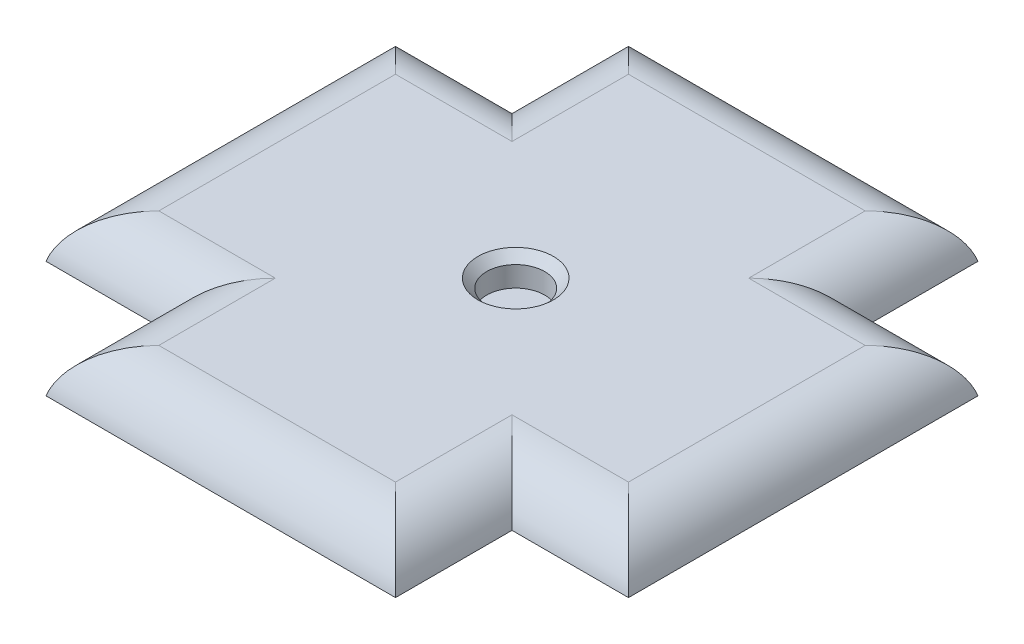
ISO-10303-21;
HEADER;
FILE_DESCRIPTION(('STEP AP214'),'2;1');
FILE_NAME('part.step','',(''),(''),'','','');
FILE_SCHEMA(('AUTOMOTIVE_DESIGN { 1 0 10303 214 1 1 1 1 }'));
ENDSEC;
DATA;
#1=APPLICATION_CONTEXT('core data for automotive mechanical design processes');
#2=APPLICATION_PROTOCOL_DEFINITION('international standard','automotive_design',2000,#1);
#3=PRODUCT_CONTEXT('',#1,'mechanical');
#4=PRODUCT('Part','Part','',(#3));
#5=PRODUCT_RELATED_PRODUCT_CATEGORY('part','',(#4));
#6=PRODUCT_DEFINITION_FORMATION('','',#4);
#7=PRODUCT_DEFINITION_CONTEXT('part definition',#1,'design');
#8=PRODUCT_DEFINITION('design','',#6,#7);
#9=PRODUCT_DEFINITION_SHAPE('','',#8);
#10=(LENGTH_UNIT() NAMED_UNIT(*) SI_UNIT(.MILLI.,.METRE.));
#11=(NAMED_UNIT(*) PLANE_ANGLE_UNIT() SI_UNIT($,.RADIAN.));
#12=(NAMED_UNIT(*) SI_UNIT($,.STERADIAN.) SOLID_ANGLE_UNIT());
#13=UNCERTAINTY_MEASURE_WITH_UNIT(LENGTH_MEASURE(1.E-05),#10,'distance_accuracy_value','');
#14=(GEOMETRIC_REPRESENTATION_CONTEXT(3) GLOBAL_UNCERTAINTY_ASSIGNED_CONTEXT((#13)) GLOBAL_UNIT_ASSIGNED_CONTEXT((#10,
#11,#12)) REPRESENTATION_CONTEXT('',''));
#15=CARTESIAN_POINT('',(0.,0.,0.));
#16=DIRECTION('',(0.,0.,1.));
#17=DIRECTION('',(1.,0.,0.));
#18=AXIS2_PLACEMENT_3D('',#15,#16,#17);
#19=CARTESIAN_POINT('',(0.,7.5,0.));
#20=DIRECTION('',(0.,1.,0.));
#21=DIRECTION('',(0.,0.,1.));
#22=AXIS2_PLACEMENT_3D('',#19,#20,#21);
#23=PLANE('',#22);
#24=CARTESIAN_POINT('',(50.3175416344815,7.5,49.6824583655185));
#25=DIRECTION('',(0.,1.,0.));
#26=DIRECTION('',(0.,0.,1.));
#27=AXIS2_PLACEMENT_3D('',#24,#25,#26);
#28=CIRCLE('',#27,6.47500000000002);
#29=CARTESIAN_POINT('',(50.3175416344815,7.5,56.1574583655186));
#30=VERTEX_POINT('',#29);
#31=EDGE_CURVE('E11',#30,#30,#28,.F.);
#32=ORIENTED_EDGE('',*,*,#31,.T.);
#33=EDGE_LOOP('',(#32));
#34=FACE_BOUND('',#33,.T.);
#35=DIRECTION('',(0.,0.,1.));
#36=VECTOR('',#35,1.);
#37=CARTESIAN_POINT('',(29.6824583655185,7.5,100.));
#38=LINE('',#37,#36);
#39=CARTESIAN_POINT('',(29.6824583655185,7.5,70.3175416344815));
#40=VERTEX_POINT('',#39);
#41=CARTESIAN_POINT('',(29.6824583655185,7.5,90.3175416344815));
#42=VERTEX_POINT('',#41);
#43=EDGE_CURVE('E60',#40,#42,#38,.T.);
#44=ORIENTED_EDGE('',*,*,#43,.T.);
#45=DIRECTION('',(-1.,0.,0.));
#46=VECTOR('',#45,1.);
#47=CARTESIAN_POINT('',(80.,7.5,90.3175416344815));
#48=LINE('',#47,#46);
#49=CARTESIAN_POINT('',(70.3175416344815,7.5,90.3175416344815));
#50=VERTEX_POINT('',#49);
#51=EDGE_CURVE('E64',#42,#50,#48,.F.);
#52=ORIENTED_EDGE('',*,*,#51,.T.);
#53=DIRECTION('',(0.,0.,1.));
#54=VECTOR('',#53,1.);
#55=CARTESIAN_POINT('',(70.3175416344815,7.5,80.));
#56=LINE('',#55,#54);
#57=CARTESIAN_POINT('',(70.3175416344815,7.5,70.3175416344815));
#58=VERTEX_POINT('',#57);
#59=EDGE_CURVE('E148',#50,#58,#56,.F.);
#60=ORIENTED_EDGE('',*,*,#59,.T.);
#61=DIRECTION('',(1.,0.,0.));
#62=VECTOR('',#61,1.);
#63=CARTESIAN_POINT('',(100.,7.5,70.3175416344815));
#64=LINE('',#63,#62);
#65=CARTESIAN_POINT('',(90.3175416344815,7.5,70.3175416344815));
#66=VERTEX_POINT('',#65);
#67=EDGE_CURVE('E224',#58,#66,#64,.T.);
#68=ORIENTED_EDGE('',*,*,#67,.T.);
#69=DIRECTION('',(0.,0.,-1.));
#70=VECTOR('',#69,1.);
#71=CARTESIAN_POINT('',(90.3175416344815,7.5,20.));
#72=LINE('',#71,#70);
#73=CARTESIAN_POINT('',(90.3175416344815,7.5,29.6824583655185));
#74=VERTEX_POINT('',#73);
#75=EDGE_CURVE('E221',#66,#74,#72,.T.);
#76=ORIENTED_EDGE('',*,*,#75,.T.);
#77=DIRECTION('',(-1.,0.,0.));
#78=VECTOR('',#77,1.);
#79=CARTESIAN_POINT('',(80.,7.5,29.6824583655185));
#80=LINE('',#79,#78);
#81=CARTESIAN_POINT('',(70.3175416344815,7.5,29.6824583655185));
#82=VERTEX_POINT('',#81);
#83=EDGE_CURVE('E215',#74,#82,#80,.T.);
#84=ORIENTED_EDGE('',*,*,#83,.T.);
#85=DIRECTION('',(0.,0.,-1.));
#86=VECTOR('',#85,1.);
#87=CARTESIAN_POINT('',(70.3175416344815,7.5,0.));
#88=LINE('',#87,#86);
#89=CARTESIAN_POINT('',(70.3175416344815,7.5,9.68245836551854));
#90=VERTEX_POINT('',#89);
#91=EDGE_CURVE('E212',#82,#90,#88,.T.);
#92=ORIENTED_EDGE('',*,*,#91,.T.);
#93=DIRECTION('',(-1.,0.,0.));
#94=VECTOR('',#93,1.);
#95=CARTESIAN_POINT('',(20.,7.5,9.68245836551854));
#96=LINE('',#95,#94);
#97=CARTESIAN_POINT('',(29.6824583655185,7.5,9.68245836551854));
#98=VERTEX_POINT('',#97);
#99=EDGE_CURVE('E209',#90,#98,#96,.T.);
#100=ORIENTED_EDGE('',*,*,#99,.T.);
#101=DIRECTION('',(0.,0.,-1.));
#102=VECTOR('',#101,1.);
#103=CARTESIAN_POINT('',(29.6824583655185,7.5,20.));
#104=LINE('',#103,#102);
#105=CARTESIAN_POINT('',(29.6824583655186,7.5,29.6824583655185));
#106=VERTEX_POINT('',#105);
#107=EDGE_CURVE('E203',#98,#106,#104,.F.);
#108=ORIENTED_EDGE('',*,*,#107,.T.);
#109=DIRECTION('',(-1.,0.,0.));
#110=VECTOR('',#109,1.);
#111=CARTESIAN_POINT('',(0.,7.5,29.6824583655185));
#112=LINE('',#111,#110);
#113=CARTESIAN_POINT('',(9.68245836551855,7.5,29.6824583655185));
#114=VERTEX_POINT('',#113);
#115=EDGE_CURVE('E200',#106,#114,#112,.T.);
#116=ORIENTED_EDGE('',*,*,#115,.T.);
#117=DIRECTION('',(0.,0.,-1.));
#118=VECTOR('',#117,1.);
#119=CARTESIAN_POINT('',(9.68245836551855,7.5,80.));
#120=LINE('',#119,#118);
#121=CARTESIAN_POINT('',(9.68245836551855,7.5,70.3175416344815));
#122=VERTEX_POINT('',#121);
#123=EDGE_CURVE('E206',#114,#122,#120,.F.);
#124=ORIENTED_EDGE('',*,*,#123,.T.);
#125=DIRECTION('',(-1.,0.,0.));
#126=VECTOR('',#125,1.);
#127=CARTESIAN_POINT('',(20.,7.5,70.3175416344815));
#128=LINE('',#127,#126);
#129=EDGE_CURVE('E218',#122,#40,#128,.F.);
#130=ORIENTED_EDGE('',*,*,#129,.T.);
#131=EDGE_LOOP('',(#44,#52,#60,#68,#76,#84,#92,#100,#108,#116,#124,#130));
#132=FACE_BOUND('',#131,.T.);
#133=ADVANCED_FACE('F43',(#34,#132),#23,.T.);
#134=CARTESIAN_POINT('',(0.,0.,0.));
#135=DIRECTION('',(0.,1.,0.));
#136=DIRECTION('',(0.,0.,1.));
#137=AXIS2_PLACEMENT_3D('',#134,#135,#136);
#138=PLANE('',#137);
#139=DIRECTION('',(1.,0.,0.));
#140=VECTOR('',#139,1.);
#141=CARTESIAN_POINT('',(0.,0.,100.));
#142=LINE('',#141,#140);
#143=CARTESIAN_POINT('',(20.,0.,100.));
#144=VERTEX_POINT('',#143);
#145=CARTESIAN_POINT('',(80.,0.,100.));
#146=VERTEX_POINT('',#145);
#147=EDGE_CURVE('E136',#144,#146,#142,.T.);
#148=ORIENTED_EDGE('',*,*,#147,.F.);
#149=DIRECTION('',(0.,0.,-1.));
#150=VECTOR('',#149,1.);
#151=CARTESIAN_POINT('',(20.,0.,0.));
#152=LINE('',#151,#150);
#153=CARTESIAN_POINT('',(20.,0.,80.));
#154=VERTEX_POINT('',#153);
#155=EDGE_CURVE('E197',#144,#154,#152,.T.);
#156=ORIENTED_EDGE('',*,*,#155,.T.);
#157=DIRECTION('',(1.,0.,0.));
#158=VECTOR('',#157,1.);
#159=CARTESIAN_POINT('',(0.,0.,80.));
#160=LINE('',#159,#158);
#161=CARTESIAN_POINT('',(0.,0.,80.));
#162=VERTEX_POINT('',#161);
#163=EDGE_CURVE('E193',#162,#154,#160,.T.);
#164=ORIENTED_EDGE('',*,*,#163,.F.);
#165=DIRECTION('',(0.,0.,1.));
#166=VECTOR('',#165,1.);
#167=CARTESIAN_POINT('',(0.,0.,0.));
#168=LINE('',#167,#166);
#169=CARTESIAN_POINT('',(0.,0.,20.));
#170=VERTEX_POINT('',#169);
#171=EDGE_CURVE('E189',#170,#162,#168,.T.);
#172=ORIENTED_EDGE('',*,*,#171,.F.);
#173=DIRECTION('',(1.,0.,0.));
#174=VECTOR('',#173,1.);
#175=CARTESIAN_POINT('',(0.,0.,20.));
#176=LINE('',#175,#174);
#177=CARTESIAN_POINT('',(20.,0.,20.));
#178=VERTEX_POINT('',#177);
#179=EDGE_CURVE('E186',#170,#178,#176,.T.);
#180=ORIENTED_EDGE('',*,*,#179,.T.);
#181=DIRECTION('',(0.,0.,1.));
#182=VECTOR('',#181,1.);
#183=CARTESIAN_POINT('',(20.,0.,0.));
#184=LINE('',#183,#182);
#185=CARTESIAN_POINT('',(20.,0.,0.));
#186=VERTEX_POINT('',#185);
#187=EDGE_CURVE('E182',#186,#178,#184,.T.);
#188=ORIENTED_EDGE('',*,*,#187,.F.);
#189=DIRECTION('',(1.,0.,0.));
#190=VECTOR('',#189,1.);
#191=CARTESIAN_POINT('',(0.,0.,0.));
#192=LINE('',#191,#190);
#193=CARTESIAN_POINT('',(80.,0.,0.));
#194=VERTEX_POINT('',#193);
#195=EDGE_CURVE('E179',#186,#194,#192,.T.);
#196=ORIENTED_EDGE('',*,*,#195,.T.);
#197=DIRECTION('',(0.,0.,1.));
#198=VECTOR('',#197,1.);
#199=CARTESIAN_POINT('',(80.,0.,0.));
#200=LINE('',#199,#198);
#201=CARTESIAN_POINT('',(80.,0.,20.));
#202=VERTEX_POINT('',#201);
#203=EDGE_CURVE('E176',#194,#202,#200,.T.);
#204=ORIENTED_EDGE('',*,*,#203,.T.);
#205=DIRECTION('',(1.,0.,0.));
#206=VECTOR('',#205,1.);
#207=CARTESIAN_POINT('',(0.,0.,20.));
#208=LINE('',#207,#206);
#209=CARTESIAN_POINT('',(100.,0.,20.));
#210=VERTEX_POINT('',#209);
#211=EDGE_CURVE('E173',#202,#210,#208,.T.);
#212=ORIENTED_EDGE('',*,*,#211,.T.);
#213=DIRECTION('',(0.,0.,1.));
#214=VECTOR('',#213,1.);
#215=CARTESIAN_POINT('',(100.,0.,0.));
#216=LINE('',#215,#214);
#217=CARTESIAN_POINT('',(100.,0.,80.));
#218=VERTEX_POINT('',#217);
#219=EDGE_CURVE('E170',#210,#218,#216,.T.);
#220=ORIENTED_EDGE('',*,*,#219,.T.);
#221=DIRECTION('',(-1.,0.,0.));
#222=VECTOR('',#221,1.);
#223=CARTESIAN_POINT('',(0.,0.,80.));
#224=LINE('',#223,#222);
#225=CARTESIAN_POINT('',(80.,0.,80.));
#226=VERTEX_POINT('',#225);
#227=EDGE_CURVE('E139',#218,#226,#224,.T.);
#228=ORIENTED_EDGE('',*,*,#227,.T.);
#229=DIRECTION('',(0.,0.,-1.));
#230=VECTOR('',#229,1.);
#231=CARTESIAN_POINT('',(80.,0.,0.));
#232=LINE('',#231,#230);
#233=EDGE_CURVE('E132',#146,#226,#232,.T.);
#234=ORIENTED_EDGE('',*,*,#233,.F.);
#235=EDGE_LOOP('',(#148,#156,#164,#172,#180,#188,#196,#204,#212,#220,#228,#234));
#236=FACE_BOUND('',#235,.T.);
#237=ADVANCED_FACE('F134',(#236),#138,.F.);
#238=CARTESIAN_POINT('',(0.,-2.5,29.6824583655185));
#239=DIRECTION('',(1.,0.,0.));
#240=DIRECTION('',(0.,0.,-1.));
#241=AXIS2_PLACEMENT_3D('',#238,#239,#240);
#242=CYLINDRICAL_SURFACE('',#241,10.);
#243=CARTESIAN_POINT('',(90.3175416344815,-2.5,29.6824583655185));
#244=DIRECTION('',(0.707106781186547,0.,0.707106781186548));
#245=DIRECTION('',(-0.707106781186548,0.,0.707106781186547));
#246=AXIS2_PLACEMENT_3D('',#243,#244,#245);
#247=ELLIPSE('',#246,14.1421356237309,10.);
#248=EDGE_CURVE('E163',#210,#74,#247,.T.);
#249=ORIENTED_EDGE('',*,*,#248,.F.);
#250=ORIENTED_EDGE('',*,*,#211,.F.);
#251=CARTESIAN_POINT('',(70.3175416344815,-2.5,29.6824583655185));
#252=DIRECTION('',(0.707106781186547,0.,0.707106781186548));
#253=DIRECTION('',(0.707106781186548,0.,-0.707106781186547));
#254=AXIS2_PLACEMENT_3D('',#251,#252,#253);
#255=ELLIPSE('',#254,14.1421356237309,10.);
#256=EDGE_CURVE('E159',#82,#202,#255,.F.);
#257=ORIENTED_EDGE('',*,*,#256,.F.);
#258=ORIENTED_EDGE('',*,*,#83,.F.);
#259=EDGE_LOOP('',(#249,#250,#257,#258));
#260=FACE_BOUND('',#259,.T.);
#261=ADVANCED_FACE('F286',(#260),#242,.T.);
#262=CARTESIAN_POINT('',(70.3175416344815,-2.5,0.));
#263=DIRECTION('',(0.,0.,1.));
#264=DIRECTION('',(1.,0.,0.));
#265=AXIS2_PLACEMENT_3D('',#262,#263,#264);
#266=CYLINDRICAL_SURFACE('',#265,10.);
#267=ORIENTED_EDGE('',*,*,#256,.T.);
#268=ORIENTED_EDGE('',*,*,#203,.F.);
#269=CARTESIAN_POINT('',(70.3175416344815,-2.5,9.68245836551854));
#270=DIRECTION('',(0.707106781186547,0.,0.707106781186547));
#271=DIRECTION('',(0.707106781186547,0.,-0.707106781186547));
#272=AXIS2_PLACEMENT_3D('',#269,#270,#271);
#273=ELLIPSE('',#272,14.1421356237309,10.);
#274=EDGE_CURVE('E258',#90,#194,#273,.F.);
#275=ORIENTED_EDGE('',*,*,#274,.F.);
#276=ORIENTED_EDGE('',*,*,#91,.F.);
#277=EDGE_LOOP('',(#267,#268,#275,#276));
#278=FACE_BOUND('',#277,.T.);
#279=ADVANCED_FACE('F325',(#278),#266,.T.);
#280=CARTESIAN_POINT('',(90.3175416344815,-2.5,0.));
#281=DIRECTION('',(0.,0.,1.));
#282=DIRECTION('',(1.,0.,0.));
#283=AXIS2_PLACEMENT_3D('',#280,#281,#282);
#284=CYLINDRICAL_SURFACE('',#283,10.);
#285=ORIENTED_EDGE('',*,*,#248,.T.);
#286=ORIENTED_EDGE('',*,*,#75,.F.);
#287=CARTESIAN_POINT('',(90.3175416344815,-2.5,70.3175416344815));
#288=DIRECTION('',(-0.707106781186547,0.,0.707106781186547));
#289=DIRECTION('',(0.707106781186547,0.,0.707106781186547));
#290=AXIS2_PLACEMENT_3D('',#287,#288,#289);
#291=ELLIPSE('',#290,14.1421356237309,10.);
#292=EDGE_CURVE('E254',#218,#66,#291,.T.);
#293=ORIENTED_EDGE('',*,*,#292,.F.);
#294=ORIENTED_EDGE('',*,*,#219,.F.);
#295=EDGE_LOOP('',(#285,#286,#293,#294));
#296=FACE_BOUND('',#295,.T.);
#297=ADVANCED_FACE('F321',(#296),#284,.T.);
#298=CARTESIAN_POINT('',(0.,-2.5,9.68245836551854));
#299=DIRECTION('',(1.,0.,0.));
#300=DIRECTION('',(0.,0.,-1.));
#301=AXIS2_PLACEMENT_3D('',#298,#299,#300);
#302=CYLINDRICAL_SURFACE('',#301,10.);
#303=ORIENTED_EDGE('',*,*,#274,.T.);
#304=ORIENTED_EDGE('',*,*,#195,.F.);
#305=CARTESIAN_POINT('',(29.6824583655185,-2.5,9.68245836551854));
#306=DIRECTION('',(-0.707106781186547,0.,0.707106781186548));
#307=DIRECTION('',(0.707106781186548,0.,0.707106781186547));
#308=AXIS2_PLACEMENT_3D('',#305,#306,#307);
#309=ELLIPSE('',#308,14.142135623731,10.);
#310=EDGE_CURVE('E250',#98,#186,#309,.T.);
#311=ORIENTED_EDGE('',*,*,#310,.F.);
#312=ORIENTED_EDGE('',*,*,#99,.F.);
#313=EDGE_LOOP('',(#303,#304,#311,#312));
#314=FACE_BOUND('',#313,.T.);
#315=ADVANCED_FACE('F317',(#314),#302,.T.);
#316=CARTESIAN_POINT('',(0.,-2.5,70.3175416344815));
#317=DIRECTION('',(-1.,0.,0.));
#318=DIRECTION('',(0.,0.,1.));
#319=AXIS2_PLACEMENT_3D('',#316,#317,#318);
#320=CYLINDRICAL_SURFACE('',#319,10.);
#321=ORIENTED_EDGE('',*,*,#292,.T.);
#322=ORIENTED_EDGE('',*,*,#67,.F.);
#323=CARTESIAN_POINT('',(70.3175416344815,-2.5,70.3175416344815));
#324=DIRECTION('',(0.707106781186547,0.,-0.707106781186547));
#325=DIRECTION('',(-0.707106781186547,0.,-0.707106781186547));
#326=AXIS2_PLACEMENT_3D('',#323,#324,#325);
#327=ELLIPSE('',#326,14.1421356237309,10.);
#328=EDGE_CURVE('E247',#226,#58,#327,.F.);
#329=ORIENTED_EDGE('',*,*,#328,.F.);
#330=ORIENTED_EDGE('',*,*,#227,.F.);
#331=EDGE_LOOP('',(#321,#322,#329,#330));
#332=FACE_BOUND('',#331,.T.);
#333=ADVANCED_FACE('F313',(#332),#320,.T.);
#334=CARTESIAN_POINT('',(29.6824583655185,-2.5,0.));
#335=DIRECTION('',(0.,0.,1.));
#336=DIRECTION('',(1.,0.,0.));
#337=AXIS2_PLACEMENT_3D('',#334,#335,#336);
#338=CYLINDRICAL_SURFACE('',#337,10.);
#339=ORIENTED_EDGE('',*,*,#310,.T.);
#340=ORIENTED_EDGE('',*,*,#187,.T.);
#341=CARTESIAN_POINT('',(29.6824583655186,-2.5,29.6824583655185));
#342=DIRECTION('',(-0.707106781186547,0.,0.707106781186548));
#343=DIRECTION('',(0.707106781186548,0.,0.707106781186547));
#344=AXIS2_PLACEMENT_3D('',#341,#342,#343);
#345=ELLIPSE('',#344,14.142135623731,10.);
#346=EDGE_CURVE('E151',#106,#178,#345,.T.);
#347=ORIENTED_EDGE('',*,*,#346,.F.);
#348=ORIENTED_EDGE('',*,*,#107,.F.);
#349=EDGE_LOOP('',(#339,#340,#347,#348));
#350=FACE_BOUND('',#349,.T.);
#351=ADVANCED_FACE('F310',(#350),#338,.T.);
#352=CARTESIAN_POINT('',(70.3175416344815,-2.5,0.));
#353=DIRECTION('',(0.,0.,-1.));
#354=DIRECTION('',(-1.,0.,0.));
#355=AXIS2_PLACEMENT_3D('',#352,#353,#354);
#356=CYLINDRICAL_SURFACE('',#355,10.);
#357=ORIENTED_EDGE('',*,*,#328,.T.);
#358=ORIENTED_EDGE('',*,*,#59,.F.);
#359=CARTESIAN_POINT('',(70.3175416344815,-2.5,90.3175416344815));
#360=DIRECTION('',(0.707106781186547,0.,-0.707106781186547));
#361=DIRECTION('',(0.707106781186547,0.,0.707106781186547));
#362=AXIS2_PLACEMENT_3D('',#359,#360,#361);
#363=ELLIPSE('',#362,14.1421356237309,10.);
#364=EDGE_CURVE('E146',#146,#50,#363,.F.);
#365=ORIENTED_EDGE('',*,*,#364,.F.);
#366=ORIENTED_EDGE('',*,*,#233,.T.);
#367=EDGE_LOOP('',(#357,#358,#365,#366));
#368=FACE_BOUND('',#367,.T.);
#369=ADVANCED_FACE('F147',(#368),#356,.T.);
#370=CARTESIAN_POINT('',(0.,-2.5,29.6824583655185));
#371=DIRECTION('',(1.,0.,0.));
#372=DIRECTION('',(0.,0.,-1.));
#373=AXIS2_PLACEMENT_3D('',#370,#371,#372);
#374=CYLINDRICAL_SURFACE('',#373,10.);
#375=ORIENTED_EDGE('',*,*,#346,.T.);
#376=ORIENTED_EDGE('',*,*,#179,.F.);
#377=CARTESIAN_POINT('',(9.68245836551855,-2.5,29.6824583655185));
#378=DIRECTION('',(0.707106781186547,0.,-0.707106781186548));
#379=DIRECTION('',(0.707106781186548,0.,0.707106781186547));
#380=AXIS2_PLACEMENT_3D('',#377,#378,#379);
#381=ELLIPSE('',#380,14.142135623731,10.);
#382=EDGE_CURVE('E152',#114,#170,#381,.F.);
#383=ORIENTED_EDGE('',*,*,#382,.F.);
#384=ORIENTED_EDGE('',*,*,#115,.F.);
#385=EDGE_LOOP('',(#375,#376,#383,#384));
#386=FACE_BOUND('',#385,.T.);
#387=ADVANCED_FACE('F304',(#386),#374,.T.);
#388=CARTESIAN_POINT('',(0.,-2.5,90.3175416344815));
#389=DIRECTION('',(1.,0.,0.));
#390=DIRECTION('',(0.,0.,-1.));
#391=AXIS2_PLACEMENT_3D('',#388,#389,#390);
#392=CYLINDRICAL_SURFACE('',#391,10.);
#393=ORIENTED_EDGE('',*,*,#364,.T.);
#394=ORIENTED_EDGE('',*,*,#51,.F.);
#395=CARTESIAN_POINT('',(29.6824583655185,-2.5,90.3175416344815));
#396=DIRECTION('',(0.707106781186548,0.,0.707106781186547));
#397=DIRECTION('',(0.707106781186547,0.,-0.707106781186548));
#398=AXIS2_PLACEMENT_3D('',#395,#396,#397);
#399=ELLIPSE('',#398,14.1421356237309,10.);
#400=EDGE_CURVE('E156',#144,#42,#399,.F.);
#401=ORIENTED_EDGE('',*,*,#400,.F.);
#402=ORIENTED_EDGE('',*,*,#147,.T.);
#403=EDGE_LOOP('',(#393,#394,#401,#402));
#404=FACE_BOUND('',#403,.T.);
#405=ADVANCED_FACE('F154',(#404),#392,.T.);
#406=CARTESIAN_POINT('',(9.68245836551854,-2.5,0.));
#407=DIRECTION('',(0.,0.,1.));
#408=DIRECTION('',(1.,0.,0.));
#409=AXIS2_PLACEMENT_3D('',#406,#407,#408);
#410=CYLINDRICAL_SURFACE('',#409,10.);
#411=ORIENTED_EDGE('',*,*,#382,.T.);
#412=ORIENTED_EDGE('',*,*,#171,.T.);
#413=CARTESIAN_POINT('',(9.68245836551855,-2.5,70.3175416344815));
#414=DIRECTION('',(0.707106781186548,0.,0.707106781186547));
#415=DIRECTION('',(-0.707106781186547,0.,0.707106781186548));
#416=AXIS2_PLACEMENT_3D('',#413,#414,#415);
#417=ELLIPSE('',#416,14.1421356237309,10.);
#418=EDGE_CURVE('E236',#122,#162,#417,.T.);
#419=ORIENTED_EDGE('',*,*,#418,.F.);
#420=ORIENTED_EDGE('',*,*,#123,.F.);
#421=EDGE_LOOP('',(#411,#412,#419,#420));
#422=FACE_BOUND('',#421,.T.);
#423=ADVANCED_FACE('F297',(#422),#410,.T.);
#424=CARTESIAN_POINT('',(29.6824583655185,-2.5,0.));
#425=DIRECTION('',(0.,0.,-1.));
#426=DIRECTION('',(-1.,0.,0.));
#427=AXIS2_PLACEMENT_3D('',#424,#425,#426);
#428=CYLINDRICAL_SURFACE('',#427,10.);
#429=ORIENTED_EDGE('',*,*,#400,.T.);
#430=ORIENTED_EDGE('',*,*,#43,.F.);
#431=CARTESIAN_POINT('',(29.6824583655185,-2.5,70.3175416344815));
#432=DIRECTION('',(0.707106781186548,0.,0.707106781186547));
#433=DIRECTION('',(0.707106781186547,0.,-0.707106781186548));
#434=AXIS2_PLACEMENT_3D('',#431,#432,#433);
#435=ELLIPSE('',#434,14.1421356237309,10.);
#436=EDGE_CURVE('E233',#154,#40,#435,.F.);
#437=ORIENTED_EDGE('',*,*,#436,.F.);
#438=ORIENTED_EDGE('',*,*,#155,.F.);
#439=EDGE_LOOP('',(#429,#430,#437,#438));
#440=FACE_BOUND('',#439,.T.);
#441=ADVANCED_FACE('F293',(#440),#428,.T.);
#442=CARTESIAN_POINT('',(0.,-2.5,70.3175416344815));
#443=DIRECTION('',(1.,0.,0.));
#444=DIRECTION('',(0.,0.,-1.));
#445=AXIS2_PLACEMENT_3D('',#442,#443,#444);
#446=CYLINDRICAL_SURFACE('',#445,10.);
#447=ORIENTED_EDGE('',*,*,#418,.T.);
#448=ORIENTED_EDGE('',*,*,#163,.T.);
#449=ORIENTED_EDGE('',*,*,#436,.T.);
#450=ORIENTED_EDGE('',*,*,#129,.F.);
#451=EDGE_LOOP('',(#447,#448,#449,#450));
#452=FACE_BOUND('',#451,.T.);
#453=ADVANCED_FACE('F290',(#452),#446,.T.);
#454=CARTESIAN_POINT('',(50.3175416344815,2.5,49.6824583655185));
#455=DIRECTION('',(0.,1.,0.));
#456=DIRECTION('',(0.,0.,1.));
#457=AXIS2_PLACEMENT_3D('',#454,#455,#456);
#458=CYLINDRICAL_SURFACE('',#457,4.975);
#459=CARTESIAN_POINT('',(50.3175416344815,5.99999999999997,49.6824583655185));
#460=DIRECTION('',(0.,1.,0.));
#461=DIRECTION('',(0.,0.,1.));
#462=AXIS2_PLACEMENT_3D('',#459,#460,#461);
#463=CIRCLE('',#462,4.975);
#464=CARTESIAN_POINT('',(50.3175416344815,5.99999999999997,54.6574583655185));
#465=VERTEX_POINT('',#464);
#466=EDGE_CURVE('E53',#465,#465,#463,.T.);
#467=ORIENTED_EDGE('',*,*,#466,.T.);
#468=EDGE_LOOP('',(#467));
#469=FACE_BOUND('',#468,.T.);
#470=CARTESIAN_POINT('',(50.3175416344815,2.5,49.6824583655185));
#471=DIRECTION('',(0.,1.,0.));
#472=DIRECTION('',(0.,0.,1.));
#473=AXIS2_PLACEMENT_3D('',#470,#471,#472);
#474=CIRCLE('',#473,4.975);
#475=CARTESIAN_POINT('',(50.3175416344815,2.5,54.6574583655185));
#476=VERTEX_POINT('',#475);
#477=EDGE_CURVE('E166',#476,#476,#474,.T.);
#478=ORIENTED_EDGE('',*,*,#477,.F.);
#479=EDGE_LOOP('',(#478));
#480=FACE_BOUND('',#479,.T.);
#481=ADVANCED_FACE('F268',(#469,#480),#458,.F.);
#482=CARTESIAN_POINT('',(50.3175416344815,2.5,49.6824583655185));
#483=DIRECTION('',(0.,1.,0.));
#484=DIRECTION('',(0.,0.,1.));
#485=AXIS2_PLACEMENT_3D('',#482,#483,#484);
#486=PLANE('',#485);
#487=ORIENTED_EDGE('',*,*,#477,.T.);
#488=EDGE_LOOP('',(#487));
#489=FACE_BOUND('',#488,.T.);
#490=ADVANCED_FACE('F272',(#489),#486,.T.);
#491=CARTESIAN_POINT('',(50.3175416344815,5.99999999999997,49.6824583655185));
#492=DIRECTION('',(0.,1.,0.));
#493=DIRECTION('',(0.,0.,1.));
#494=AXIS2_PLACEMENT_3D('',#491,#492,#493);
#495=CONICAL_SURFACE('',#494,4.975,0.785398163397447);
#496=CARTESIAN_POINT('',(50.3175416344815,7.5,56.1574583655186));
#497=CARTESIAN_POINT('',(50.3175416344815,7.484375,56.1418333655186));
#498=CARTESIAN_POINT('',(50.3175416344815,7.46875,56.1262083655186));
#499=CARTESIAN_POINT('',(50.3175416344815,7.4375,56.0949583655186));
#500=CARTESIAN_POINT('',(50.3175416344815,7.421875,56.0793333655186));
#501=CARTESIAN_POINT('',(50.3175416344815,7.390625,56.0480833655186));
#502=CARTESIAN_POINT('',(50.3175416344815,7.375,56.0324583655186));
#503=CARTESIAN_POINT('',(50.3175416344815,7.34375,56.0012083655186));
#504=CARTESIAN_POINT('',(50.3175416344815,7.328125,55.9855833655186));
#505=CARTESIAN_POINT('',(50.3175416344815,7.296875,55.9543333655186));
#506=CARTESIAN_POINT('',(50.3175416344815,7.28124999999999,55.9387083655186));
#507=CARTESIAN_POINT('',(50.3175416344815,7.24999999999999,55.9074583655186));
#508=CARTESIAN_POINT('',(50.3175416344815,7.23437499999999,55.8918333655186));
#509=CARTESIAN_POINT('',(50.3175416344815,7.20312499999999,55.8605833655186));
#510=CARTESIAN_POINT('',(50.3175416344815,7.18749999999999,55.8449583655186));
#511=CARTESIAN_POINT('',(50.3175416344815,7.15624999999999,55.8137083655186));
#512=CARTESIAN_POINT('',(50.3175416344815,7.14062499999999,55.7980833655186));
#513=CARTESIAN_POINT('',(50.3175416344815,7.10937499999999,55.7668333655186));
#514=CARTESIAN_POINT('',(50.3175416344815,7.09374999999999,55.7512083655186));
#515=CARTESIAN_POINT('',(50.3175416344815,7.06249999999999,55.7199583655186));
#516=CARTESIAN_POINT('',(50.3175416344815,7.04687499999999,55.7043333655186));
#517=CARTESIAN_POINT('',(50.3175416344815,7.01562499999999,55.6730833655186));
#518=CARTESIAN_POINT('',(50.3175416344815,6.99999999999999,55.6574583655186));
#519=CARTESIAN_POINT('',(50.3175416344815,6.96874999999999,55.6262083655186));
#520=CARTESIAN_POINT('',(50.3175416344815,6.95312499999999,55.6105833655186));
#521=CARTESIAN_POINT('',(50.3175416344815,6.92187499999999,55.5793333655186));
#522=CARTESIAN_POINT('',(50.3175416344815,6.90624999999999,55.5637083655186));
#523=CARTESIAN_POINT('',(50.3175416344815,6.87499999999999,55.5324583655186));
#524=CARTESIAN_POINT('',(50.3175416344815,6.85937499999999,55.5168333655186));
#525=CARTESIAN_POINT('',(50.3175416344815,6.82812499999999,55.4855833655186));
#526=CARTESIAN_POINT('',(50.3175416344815,6.81249999999999,55.4699583655186));
#527=CARTESIAN_POINT('',(50.3175416344815,6.78124999999999,55.4387083655186));
#528=CARTESIAN_POINT('',(50.3175416344815,6.76562499999998,55.4230833655186));
#529=CARTESIAN_POINT('',(50.3175416344815,6.73437499999998,55.3918333655186));
#530=CARTESIAN_POINT('',(50.3175416344815,6.71874999999998,55.3762083655186));
#531=CARTESIAN_POINT('',(50.3175416344815,6.68749999999998,55.3449583655186));
#532=CARTESIAN_POINT('',(50.3175416344815,6.67187499999998,55.3293333655186));
#533=CARTESIAN_POINT('',(50.3175416344815,6.64062499999998,55.2980833655186));
#534=CARTESIAN_POINT('',(50.3175416344815,6.62499999999998,55.2824583655186));
#535=CARTESIAN_POINT('',(50.3175416344815,6.59374999999998,55.2512083655186));
#536=CARTESIAN_POINT('',(50.3175416344815,6.57812499999998,55.2355833655186));
#537=CARTESIAN_POINT('',(50.3175416344815,6.54687499999998,55.2043333655186));
#538=CARTESIAN_POINT('',(50.3175416344815,6.53124999999998,55.1887083655186));
#539=CARTESIAN_POINT('',(50.3175416344815,6.49999999999998,55.1574583655186));
#540=CARTESIAN_POINT('',(50.3175416344815,6.48437499999998,55.1418333655186));
#541=CARTESIAN_POINT('',(50.3175416344815,6.45312499999998,55.1105833655186));
#542=CARTESIAN_POINT('',(50.3175416344815,6.43749999999998,55.0949583655185));
#543=CARTESIAN_POINT('',(50.3175416344815,6.40624999999998,55.0637083655186));
#544=CARTESIAN_POINT('',(50.3175416344815,6.39062499999998,55.0480833655186));
#545=CARTESIAN_POINT('',(50.3175416344815,6.35937499999998,55.0168333655186));
#546=CARTESIAN_POINT('',(50.3175416344815,6.34374999999998,55.0012083655186));
#547=CARTESIAN_POINT('',(50.3175416344815,6.31249999999998,54.9699583655186));
#548=CARTESIAN_POINT('',(50.3175416344815,6.29687499999998,54.9543333655185));
#549=CARTESIAN_POINT('',(50.3175416344815,6.26562499999998,54.9230833655186));
#550=CARTESIAN_POINT('',(50.3175416344815,6.24999999999998,54.9074583655185));
#551=CARTESIAN_POINT('',(50.3175416344815,6.21874999999998,54.8762083655186));
#552=CARTESIAN_POINT('',(50.3175416344815,6.20312499999998,54.8605833655185));
#553=CARTESIAN_POINT('',(50.3175416344815,6.17187499999998,54.8293333655185));
#554=CARTESIAN_POINT('',(50.3175416344815,6.15624999999997,54.8137083655185));
#555=CARTESIAN_POINT('',(50.3175416344815,6.12499999999997,54.7824583655185));
#556=CARTESIAN_POINT('',(50.3175416344815,6.10937499999997,54.7668333655185));
#557=CARTESIAN_POINT('',(50.3175416344815,6.07812499999997,54.7355833655185));
#558=CARTESIAN_POINT('',(50.3175416344815,6.06249999999997,54.7199583655185));
#559=CARTESIAN_POINT('',(50.3175416344815,6.03124999999997,54.6887083655185));
#560=CARTESIAN_POINT('',(50.3175416344815,6.01562499999997,54.6730833655185));
#561=CARTESIAN_POINT('',(50.3175416344815,5.99999999999997,54.6574583655185));
#562=B_SPLINE_CURVE_WITH_KNOTS('',3,(#496,#497,#498,#499,#500,#501,#502,#503,#504,#505,#506,
#507,#508,#509,#510,#511,#512,#513,#514,#515,#516,#517,#518,#519,#520,#521,#522,#523,#524,#525,
#526,#527,#528,#529,#530,#531,#532,#533,#534,#535,#536,#537,#538,#539,#540,#541,#542,#543,#544,
#545,#546,#547,#548,#549,#550,#551,#552,#553,#554,#555,#556,#557,#558,#559,#560,#561),
.UNSPECIFIED.,.F.,.F.,(4,2,2,2,2,2,2,2,2,2,2,2,2,2,2,2,2,2,2,2,2,2,2,2,2,2,2,2,2,2,2,2,4),(0.,
0.0662912607362407,0.132582521472481,0.198873782208722,0.265165042944962,0.331456303681199,
0.397747564417439,0.46403882515368,0.53033008588992,0.596621346626161,0.662912607362402,
0.729203868098638,0.795495128834878,0.861786389571119,0.92807765030736,0.994368911043601,
1.06066017177984,1.12695143251608,1.19324269325232,1.25953395398856,1.3258252147248,
1.39211647546104,1.45840773619728,1.52469899693352,1.59099025766976,1.657281518406,
1.72357277914224,1.78986403987848,1.85615530061472,1.92244656135096,1.9887378220872,
2.05502908282344,2.12132034355968),.UNSPECIFIED.);
#563=EDGE_CURVE('BSEAM46',#30,#465,#562,.T.);
#564=ORIENTED_EDGE('',*,*,#31,.F.);
#565=ORIENTED_EDGE('',*,*,#466,.F.);
#566=ORIENTED_EDGE('',*,*,#563,.T.);
#567=ORIENTED_EDGE('',*,*,#563,.F.);
#568=EDGE_LOOP('',(#564,#566,#565,#567));
#569=FACE_BOUND('',#568,.T.);
#570=ADVANCED_FACE('F46',(#569),#495,.F.);
#571=CLOSED_SHELL('',(#133,#237,#261,#279,#297,#315,#333,#351,#369,#387,#405,#423,#441,#453,
#481,#490,#570));
#572=MANIFOLD_SOLID_BREP('B2',#571);
#573=ADVANCED_BREP_SHAPE_REPRESENTATION('',(#18,#572),#14);
#574=SHAPE_DEFINITION_REPRESENTATION(#9,#573);
ENDSEC;
END-ISO-10303-21;
